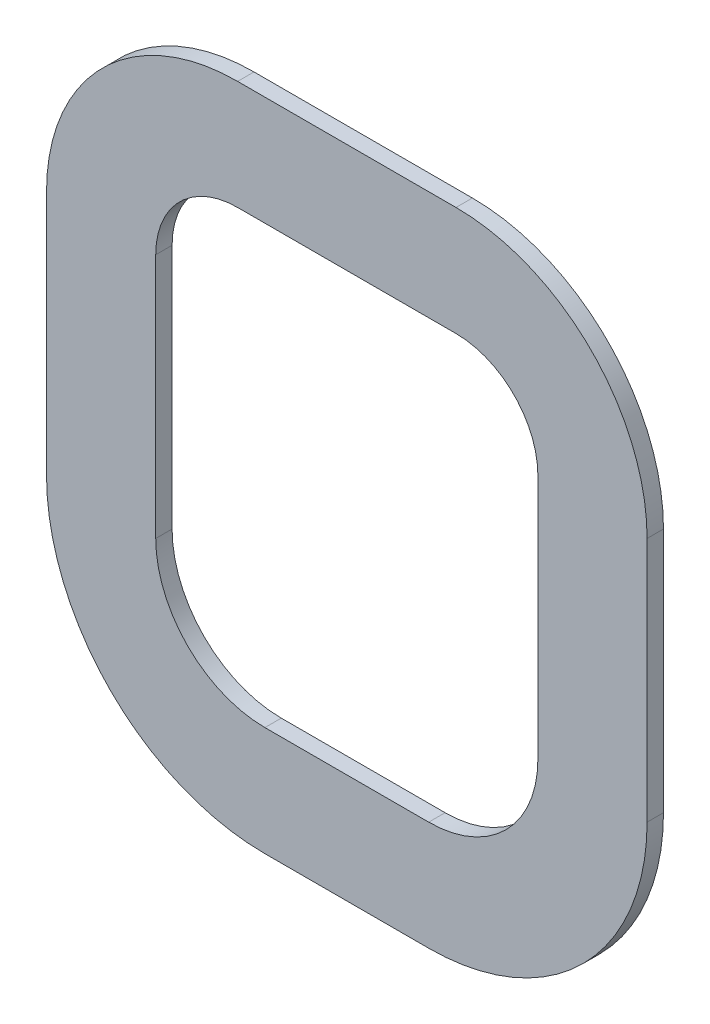
ISO-10303-21;
HEADER;
FILE_DESCRIPTION(('STEP AP214'),'2;1');
FILE_NAME('part.step','',(''),(''),'','','');
FILE_SCHEMA(('AUTOMOTIVE_DESIGN { 1 0 10303 214 1 1 1 1 }'));
ENDSEC;
DATA;
#1=APPLICATION_CONTEXT('core data for automotive mechanical design processes');
#2=APPLICATION_PROTOCOL_DEFINITION('international standard','automotive_design',2000,#1);
#3=PRODUCT_CONTEXT('',#1,'mechanical');
#4=PRODUCT('Part','Part','',(#3));
#5=PRODUCT_RELATED_PRODUCT_CATEGORY('part','',(#4));
#6=PRODUCT_DEFINITION_FORMATION('','',#4);
#7=PRODUCT_DEFINITION_CONTEXT('part definition',#1,'design');
#8=PRODUCT_DEFINITION('design','',#6,#7);
#9=PRODUCT_DEFINITION_SHAPE('','',#8);
#10=(LENGTH_UNIT() NAMED_UNIT(*) SI_UNIT(.MILLI.,.METRE.));
#11=(NAMED_UNIT(*) PLANE_ANGLE_UNIT() SI_UNIT($,.RADIAN.));
#12=(NAMED_UNIT(*) SI_UNIT($,.STERADIAN.) SOLID_ANGLE_UNIT());
#13=UNCERTAINTY_MEASURE_WITH_UNIT(LENGTH_MEASURE(1.E-05),#10,'distance_accuracy_value','');
#14=(GEOMETRIC_REPRESENTATION_CONTEXT(3) GLOBAL_UNCERTAINTY_ASSIGNED_CONTEXT((#13)) GLOBAL_UNIT_ASSIGNED_CONTEXT((#10,
#11,#12)) REPRESENTATION_CONTEXT('',''));
#15=CARTESIAN_POINT('',(0.,0.,0.));
#16=DIRECTION('',(0.,0.,1.));
#17=DIRECTION('',(1.,0.,0.));
#18=AXIS2_PLACEMENT_3D('',#15,#16,#17);
#19=CARTESIAN_POINT('',(-20.,17.,3.));
#20=DIRECTION('',(0.,0.,-1.));
#21=DIRECTION('',(-1.,0.,0.));
#22=AXIS2_PLACEMENT_3D('',#19,#20,#21);
#23=PLANE('',#22);
#24=CARTESIAN_POINT('',(-20.,17.,3.));
#25=DIRECTION('',(0.,0.,1.));
#26=DIRECTION('',(-1.,0.,0.));
#27=AXIS2_PLACEMENT_3D('',#24,#25,#26);
#28=CIRCLE('',#27,35.);
#29=CARTESIAN_POINT('',(-20.,52.,3.));
#30=VERTEX_POINT('',#29);
#31=CARTESIAN_POINT('',(-55.,17.,3.));
#32=VERTEX_POINT('',#31);
#33=EDGE_CURVE('E216',#30,#32,#28,.T.);
#34=ORIENTED_EDGE('',*,*,#33,.T.);
#35=DIRECTION('',(0.,-1.,0.));
#36=VECTOR('',#35,1.);
#37=CARTESIAN_POINT('',(-55.,17.,3.));
#38=LINE('',#37,#36);
#39=CARTESIAN_POINT('',(-55.,-28.,3.));
#40=VERTEX_POINT('',#39);
#41=EDGE_CURVE('E219',#32,#40,#38,.T.);
#42=ORIENTED_EDGE('',*,*,#41,.T.);
#43=CARTESIAN_POINT('',(-15.,-28.,3.));
#44=DIRECTION('',(0.,0.,1.));
#45=DIRECTION('',(1.,0.,0.));
#46=AXIS2_PLACEMENT_3D('',#43,#44,#45);
#47=CIRCLE('',#46,40.);
#48=CARTESIAN_POINT('',(-15.,-68.,3.));
#49=VERTEX_POINT('',#48);
#50=EDGE_CURVE('E222',#40,#49,#47,.T.);
#51=ORIENTED_EDGE('',*,*,#50,.T.);
#52=DIRECTION('',(1.,0.,0.));
#53=VECTOR('',#52,1.);
#54=CARTESIAN_POINT('',(-15.,-68.,3.));
#55=LINE('',#54,#53);
#56=CARTESIAN_POINT('',(15.,-68.,3.));
#57=VERTEX_POINT('',#56);
#58=EDGE_CURVE('E224',#49,#57,#55,.T.);
#59=ORIENTED_EDGE('',*,*,#58,.T.);
#60=CARTESIAN_POINT('',(15.,-28.,3.));
#61=DIRECTION('',(0.,0.,1.));
#62=DIRECTION('',(1.,0.,0.));
#63=AXIS2_PLACEMENT_3D('',#60,#61,#62);
#64=CIRCLE('',#63,40.);
#65=CARTESIAN_POINT('',(55.,-28.,3.));
#66=VERTEX_POINT('',#65);
#67=EDGE_CURVE('E226',#57,#66,#64,.T.);
#68=ORIENTED_EDGE('',*,*,#67,.T.);
#69=DIRECTION('',(0.,1.,0.));
#70=VECTOR('',#69,1.);
#71=CARTESIAN_POINT('',(55.,17.,3.));
#72=LINE('',#71,#70);
#73=CARTESIAN_POINT('',(55.,17.,3.));
#74=VERTEX_POINT('',#73);
#75=EDGE_CURVE('E228',#66,#74,#72,.T.);
#76=ORIENTED_EDGE('',*,*,#75,.T.);
#77=CARTESIAN_POINT('',(20.,17.,3.));
#78=DIRECTION('',(0.,0.,1.));
#79=DIRECTION('',(-1.,0.,0.));
#80=AXIS2_PLACEMENT_3D('',#77,#78,#79);
#81=CIRCLE('',#80,35.);
#82=CARTESIAN_POINT('',(20.,52.,3.));
#83=VERTEX_POINT('',#82);
#84=EDGE_CURVE('E230',#74,#83,#81,.T.);
#85=ORIENTED_EDGE('',*,*,#84,.T.);
#86=DIRECTION('',(-1.,0.,0.));
#87=VECTOR('',#86,1.);
#88=CARTESIAN_POINT('',(-20.,52.,3.));
#89=LINE('',#88,#87);
#90=EDGE_CURVE('E232',#83,#30,#89,.T.);
#91=ORIENTED_EDGE('',*,*,#90,.T.);
#92=EDGE_LOOP('',(#34,#42,#51,#59,#68,#76,#85,#91));
#93=FACE_BOUND('',#92,.T.);
#94=CARTESIAN_POINT('',(-20.,17.,3.));
#95=DIRECTION('',(0.,0.,1.));
#96=DIRECTION('',(-1.,0.,0.));
#97=AXIS2_PLACEMENT_3D('',#94,#95,#96);
#98=CIRCLE('',#97,15.);
#99=CARTESIAN_POINT('',(-20.,32.,3.));
#100=VERTEX_POINT('',#99);
#101=CARTESIAN_POINT('',(-35.,17.,3.));
#102=VERTEX_POINT('',#101);
#103=EDGE_CURVE('E150',#100,#102,#98,.T.);
#104=ORIENTED_EDGE('',*,*,#103,.F.);
#105=DIRECTION('',(-1.,0.,0.));
#106=VECTOR('',#105,1.);
#107=CARTESIAN_POINT('',(-20.,32.,3.));
#108=LINE('',#107,#106);
#109=CARTESIAN_POINT('',(20.,32.,3.));
#110=VERTEX_POINT('',#109);
#111=EDGE_CURVE('E183',#110,#100,#108,.T.);
#112=ORIENTED_EDGE('',*,*,#111,.F.);
#113=CARTESIAN_POINT('',(20.,17.,3.));
#114=DIRECTION('',(0.,0.,1.));
#115=DIRECTION('',(-1.,0.,0.));
#116=AXIS2_PLACEMENT_3D('',#113,#114,#115);
#117=CIRCLE('',#116,15.);
#118=CARTESIAN_POINT('',(35.,17.,3.));
#119=VERTEX_POINT('',#118);
#120=EDGE_CURVE('E181',#119,#110,#117,.T.);
#121=ORIENTED_EDGE('',*,*,#120,.F.);
#122=DIRECTION('',(0.,1.,0.));
#123=VECTOR('',#122,1.);
#124=CARTESIAN_POINT('',(35.,17.,3.));
#125=LINE('',#124,#123);
#126=CARTESIAN_POINT('',(35.,-28.,3.));
#127=VERTEX_POINT('',#126);
#128=EDGE_CURVE('E179',#127,#119,#125,.T.);
#129=ORIENTED_EDGE('',*,*,#128,.F.);
#130=CARTESIAN_POINT('',(15.,-28.,3.));
#131=DIRECTION('',(0.,0.,1.));
#132=DIRECTION('',(1.,0.,0.));
#133=AXIS2_PLACEMENT_3D('',#130,#131,#132);
#134=CIRCLE('',#133,20.);
#135=CARTESIAN_POINT('',(15.,-48.,3.));
#136=VERTEX_POINT('',#135);
#137=EDGE_CURVE('E177',#136,#127,#134,.T.);
#138=ORIENTED_EDGE('',*,*,#137,.F.);
#139=DIRECTION('',(1.,0.,0.));
#140=VECTOR('',#139,1.);
#141=CARTESIAN_POINT('',(-15.,-48.,3.));
#142=LINE('',#141,#140);
#143=CARTESIAN_POINT('',(-15.,-48.,3.));
#144=VERTEX_POINT('',#143);
#145=EDGE_CURVE('E173',#144,#136,#142,.T.);
#146=ORIENTED_EDGE('',*,*,#145,.F.);
#147=CARTESIAN_POINT('',(-15.,-28.,3.));
#148=DIRECTION('',(0.,0.,1.));
#149=DIRECTION('',(1.,0.,0.));
#150=AXIS2_PLACEMENT_3D('',#147,#148,#149);
#151=CIRCLE('',#150,20.);
#152=CARTESIAN_POINT('',(-35.,-28.,3.));
#153=VERTEX_POINT('',#152);
#154=EDGE_CURVE('E171',#153,#144,#151,.T.);
#155=ORIENTED_EDGE('',*,*,#154,.F.);
#156=DIRECTION('',(0.,-1.,0.));
#157=VECTOR('',#156,1.);
#158=CARTESIAN_POINT('',(-35.,17.,3.));
#159=LINE('',#158,#157);
#160=EDGE_CURVE('E158',#102,#153,#159,.T.);
#161=ORIENTED_EDGE('',*,*,#160,.F.);
#162=EDGE_LOOP('',(#104,#112,#121,#129,#138,#146,#155,#161));
#163=FACE_BOUND('',#162,.T.);
#164=ADVANCED_FACE('F37',(#93,#163),#23,.F.);
#165=CARTESIAN_POINT('',(-20.,17.,0.));
#166=DIRECTION('',(0.,0.,-1.));
#167=DIRECTION('',(-1.,0.,0.));
#168=AXIS2_PLACEMENT_3D('',#165,#166,#167);
#169=PLANE('',#168);
#170=CARTESIAN_POINT('',(-20.,17.,0.));
#171=DIRECTION('',(0.,0.,1.));
#172=DIRECTION('',(-1.,0.,0.));
#173=AXIS2_PLACEMENT_3D('',#170,#171,#172);
#174=CIRCLE('',#173,35.);
#175=CARTESIAN_POINT('',(-20.,52.,0.));
#176=VERTEX_POINT('',#175);
#177=CARTESIAN_POINT('',(-55.,17.,0.));
#178=VERTEX_POINT('',#177);
#179=EDGE_CURVE('E166',#176,#178,#174,.T.);
#180=ORIENTED_EDGE('',*,*,#179,.F.);
#181=DIRECTION('',(-1.,0.,0.));
#182=VECTOR('',#181,1.);
#183=CARTESIAN_POINT('',(-20.,52.,0.));
#184=LINE('',#183,#182);
#185=CARTESIAN_POINT('',(20.,52.,0.));
#186=VERTEX_POINT('',#185);
#187=EDGE_CURVE('E220',#186,#176,#184,.T.);
#188=ORIENTED_EDGE('',*,*,#187,.F.);
#189=CARTESIAN_POINT('',(20.,17.,0.));
#190=DIRECTION('',(0.,0.,1.));
#191=DIRECTION('',(-1.,0.,0.));
#192=AXIS2_PLACEMENT_3D('',#189,#190,#191);
#193=CIRCLE('',#192,35.);
#194=CARTESIAN_POINT('',(55.,17.,0.));
#195=VERTEX_POINT('',#194);
#196=EDGE_CURVE('E248',#195,#186,#193,.T.);
#197=ORIENTED_EDGE('',*,*,#196,.F.);
#198=DIRECTION('',(0.,1.,0.));
#199=VECTOR('',#198,1.);
#200=CARTESIAN_POINT('',(55.,17.,0.));
#201=LINE('',#200,#199);
#202=CARTESIAN_POINT('',(55.,-28.,0.));
#203=VERTEX_POINT('',#202);
#204=EDGE_CURVE('E246',#203,#195,#201,.T.);
#205=ORIENTED_EDGE('',*,*,#204,.F.);
#206=CARTESIAN_POINT('',(15.,-28.,0.));
#207=DIRECTION('',(0.,0.,1.));
#208=DIRECTION('',(1.,0.,0.));
#209=AXIS2_PLACEMENT_3D('',#206,#207,#208);
#210=CIRCLE('',#209,40.);
#211=CARTESIAN_POINT('',(15.,-68.,0.));
#212=VERTEX_POINT('',#211);
#213=EDGE_CURVE('E244',#212,#203,#210,.T.);
#214=ORIENTED_EDGE('',*,*,#213,.F.);
#215=DIRECTION('',(1.,0.,0.));
#216=VECTOR('',#215,1.);
#217=CARTESIAN_POINT('',(0.50000000000002,-68.,0.));
#218=LINE('',#217,#216);
#219=CARTESIAN_POINT('',(-15.,-68.,0.));
#220=VERTEX_POINT('',#219);
#221=EDGE_CURVE('E242',#220,#212,#218,.T.);
#222=ORIENTED_EDGE('',*,*,#221,.F.);
#223=CARTESIAN_POINT('',(-15.,-28.,0.));
#224=DIRECTION('',(0.,0.,1.));
#225=DIRECTION('',(1.,0.,0.));
#226=AXIS2_PLACEMENT_3D('',#223,#224,#225);
#227=CIRCLE('',#226,40.);
#228=CARTESIAN_POINT('',(-55.,-28.,0.));
#229=VERTEX_POINT('',#228);
#230=EDGE_CURVE('E239',#229,#220,#227,.T.);
#231=ORIENTED_EDGE('',*,*,#230,.F.);
#232=DIRECTION('',(0.,-1.,0.));
#233=VECTOR('',#232,1.);
#234=CARTESIAN_POINT('',(-55.,17.,0.));
#235=LINE('',#234,#233);
#236=EDGE_CURVE('E237',#178,#229,#235,.T.);
#237=ORIENTED_EDGE('',*,*,#236,.F.);
#238=EDGE_LOOP('',(#180,#188,#197,#205,#214,#222,#231,#237));
#239=FACE_BOUND('',#238,.T.);
#240=DIRECTION('',(-1.,0.,0.));
#241=VECTOR('',#240,1.);
#242=CARTESIAN_POINT('',(-20.,32.,0.));
#243=LINE('',#242,#241);
#244=CARTESIAN_POINT('',(20.,32.,0.));
#245=VERTEX_POINT('',#244);
#246=CARTESIAN_POINT('',(-20.,32.,0.));
#247=VERTEX_POINT('',#246);
#248=EDGE_CURVE('E159',#245,#247,#243,.T.);
#249=ORIENTED_EDGE('',*,*,#248,.T.);
#250=CARTESIAN_POINT('',(-20.,17.,0.));
#251=DIRECTION('',(0.,0.,1.));
#252=DIRECTION('',(-1.,0.,0.));
#253=AXIS2_PLACEMENT_3D('',#250,#251,#252);
#254=CIRCLE('',#253,15.);
#255=CARTESIAN_POINT('',(-35.,17.,0.));
#256=VERTEX_POINT('',#255);
#257=EDGE_CURVE('E60',#247,#256,#254,.T.);
#258=ORIENTED_EDGE('',*,*,#257,.T.);
#259=DIRECTION('',(0.,-1.,0.));
#260=VECTOR('',#259,1.);
#261=CARTESIAN_POINT('',(-35.,17.,0.));
#262=LINE('',#261,#260);
#263=CARTESIAN_POINT('',(-35.,-28.,0.));
#264=VERTEX_POINT('',#263);
#265=EDGE_CURVE('E165',#256,#264,#262,.T.);
#266=ORIENTED_EDGE('',*,*,#265,.T.);
#267=CARTESIAN_POINT('',(-15.,-28.,0.));
#268=DIRECTION('',(0.,0.,1.));
#269=DIRECTION('',(1.,0.,0.));
#270=AXIS2_PLACEMENT_3D('',#267,#268,#269);
#271=CIRCLE('',#270,20.);
#272=CARTESIAN_POINT('',(-15.,-48.,0.));
#273=VERTEX_POINT('',#272);
#274=EDGE_CURVE('E187',#264,#273,#271,.T.);
#275=ORIENTED_EDGE('',*,*,#274,.T.);
#276=DIRECTION('',(1.,0.,0.));
#277=VECTOR('',#276,1.);
#278=CARTESIAN_POINT('',(0.50000000000002,-48.,0.));
#279=LINE('',#278,#277);
#280=CARTESIAN_POINT('',(15.,-48.,0.));
#281=VERTEX_POINT('',#280);
#282=EDGE_CURVE('E190',#273,#281,#279,.T.);
#283=ORIENTED_EDGE('',*,*,#282,.T.);
#284=CARTESIAN_POINT('',(15.,-28.,0.));
#285=DIRECTION('',(0.,0.,1.));
#286=DIRECTION('',(1.,0.,0.));
#287=AXIS2_PLACEMENT_3D('',#284,#285,#286);
#288=CIRCLE('',#287,20.);
#289=CARTESIAN_POINT('',(35.,-28.,0.));
#290=VERTEX_POINT('',#289);
#291=EDGE_CURVE('E193',#281,#290,#288,.T.);
#292=ORIENTED_EDGE('',*,*,#291,.T.);
#293=DIRECTION('',(0.,1.,0.));
#294=VECTOR('',#293,1.);
#295=CARTESIAN_POINT('',(35.,17.,0.));
#296=LINE('',#295,#294);
#297=CARTESIAN_POINT('',(35.,17.,0.));
#298=VERTEX_POINT('',#297);
#299=EDGE_CURVE('E196',#290,#298,#296,.T.);
#300=ORIENTED_EDGE('',*,*,#299,.T.);
#301=CARTESIAN_POINT('',(20.,17.,0.));
#302=DIRECTION('',(0.,0.,1.));
#303=DIRECTION('',(-1.,0.,0.));
#304=AXIS2_PLACEMENT_3D('',#301,#302,#303);
#305=CIRCLE('',#304,15.);
#306=EDGE_CURVE('E199',#298,#245,#305,.T.);
#307=ORIENTED_EDGE('',*,*,#306,.T.);
#308=EDGE_LOOP('',(#249,#258,#266,#275,#283,#292,#300,#307));
#309=FACE_BOUND('',#308,.T.);
#310=ADVANCED_FACE('F277',(#239,#309),#169,.T.);
#311=CARTESIAN_POINT('',(-20.,17.,3.));
#312=DIRECTION('',(0.,0.,-1.));
#313=DIRECTION('',(-1.,0.,0.));
#314=AXIS2_PLACEMENT_3D('',#311,#312,#313);
#315=CYLINDRICAL_SURFACE('',#314,35.);
#316=ORIENTED_EDGE('',*,*,#179,.T.);
#317=DIRECTION('',(0.,0.,-1.));
#318=VECTOR('',#317,1.);
#319=CARTESIAN_POINT('',(-55.,17.,3.));
#320=LINE('',#319,#318);
#321=EDGE_CURVE('E11',#32,#178,#320,.T.);
#322=ORIENTED_EDGE('',*,*,#321,.F.);
#323=ORIENTED_EDGE('',*,*,#33,.F.);
#324=DIRECTION('',(0.,0.,-1.));
#325=VECTOR('',#324,1.);
#326=CARTESIAN_POINT('',(-20.,52.,3.));
#327=LINE('',#326,#325);
#328=EDGE_CURVE('E234',#30,#176,#327,.T.);
#329=ORIENTED_EDGE('',*,*,#328,.T.);
#330=EDGE_LOOP('',(#316,#322,#323,#329));
#331=FACE_BOUND('',#330,.T.);
#332=ADVANCED_FACE('F39',(#331),#315,.T.);
#333=CARTESIAN_POINT('',(-55.,17.,3.));
#334=DIRECTION('',(1.,0.,0.));
#335=DIRECTION('',(0.,0.,-1.));
#336=AXIS2_PLACEMENT_3D('',#333,#334,#335);
#337=PLANE('',#336);
#338=ORIENTED_EDGE('',*,*,#236,.T.);
#339=DIRECTION('',(0.,0.,-1.));
#340=VECTOR('',#339,1.);
#341=CARTESIAN_POINT('',(-55.,-28.,3.));
#342=LINE('',#341,#340);
#343=EDGE_CURVE('E45',#40,#229,#342,.T.);
#344=ORIENTED_EDGE('',*,*,#343,.F.);
#345=ORIENTED_EDGE('',*,*,#41,.F.);
#346=ORIENTED_EDGE('',*,*,#321,.T.);
#347=EDGE_LOOP('',(#338,#344,#345,#346));
#348=FACE_BOUND('',#347,.T.);
#349=ADVANCED_FACE('F294',(#348),#337,.F.);
#350=CARTESIAN_POINT('',(-15.,-28.,3.));
#351=DIRECTION('',(0.,0.,-1.));
#352=DIRECTION('',(-1.,0.,0.));
#353=AXIS2_PLACEMENT_3D('',#350,#351,#352);
#354=CYLINDRICAL_SURFACE('',#353,40.);
#355=ORIENTED_EDGE('',*,*,#230,.T.);
#356=DIRECTION('',(0.,0.,-1.));
#357=VECTOR('',#356,1.);
#358=CARTESIAN_POINT('',(-15.,-68.,3.));
#359=LINE('',#358,#357);
#360=EDGE_CURVE('E265',#49,#220,#359,.T.);
#361=ORIENTED_EDGE('',*,*,#360,.F.);
#362=ORIENTED_EDGE('',*,*,#50,.F.);
#363=ORIENTED_EDGE('',*,*,#343,.T.);
#364=EDGE_LOOP('',(#355,#361,#362,#363));
#365=FACE_BOUND('',#364,.T.);
#366=ADVANCED_FACE('F272',(#365),#354,.T.);
#367=CARTESIAN_POINT('',(0.50000000000002,-68.,3.));
#368=DIRECTION('',(0.,1.,0.));
#369=DIRECTION('',(0.,0.,1.));
#370=AXIS2_PLACEMENT_3D('',#367,#368,#369);
#371=PLANE('',#370);
#372=ORIENTED_EDGE('',*,*,#221,.T.);
#373=DIRECTION('',(0.,0.,-1.));
#374=VECTOR('',#373,1.);
#375=CARTESIAN_POINT('',(15.,-68.,3.));
#376=LINE('',#375,#374);
#377=EDGE_CURVE('E262',#57,#212,#376,.T.);
#378=ORIENTED_EDGE('',*,*,#377,.F.);
#379=ORIENTED_EDGE('',*,*,#58,.F.);
#380=ORIENTED_EDGE('',*,*,#360,.T.);
#381=EDGE_LOOP('',(#372,#378,#379,#380));
#382=FACE_BOUND('',#381,.T.);
#383=ADVANCED_FACE('F283',(#382),#371,.F.);
#384=CARTESIAN_POINT('',(15.,-28.,3.));
#385=DIRECTION('',(0.,0.,-1.));
#386=DIRECTION('',(-1.,0.,0.));
#387=AXIS2_PLACEMENT_3D('',#384,#385,#386);
#388=CYLINDRICAL_SURFACE('',#387,40.);
#389=ORIENTED_EDGE('',*,*,#213,.T.);
#390=DIRECTION('',(0.,0.,-1.));
#391=VECTOR('',#390,1.);
#392=CARTESIAN_POINT('',(55.,-28.,3.));
#393=LINE('',#392,#391);
#394=EDGE_CURVE('E259',#66,#203,#393,.T.);
#395=ORIENTED_EDGE('',*,*,#394,.F.);
#396=ORIENTED_EDGE('',*,*,#67,.F.);
#397=ORIENTED_EDGE('',*,*,#377,.T.);
#398=EDGE_LOOP('',(#389,#395,#396,#397));
#399=FACE_BOUND('',#398,.T.);
#400=ADVANCED_FACE('F287',(#399),#388,.T.);
#401=CARTESIAN_POINT('',(55.,17.,3.));
#402=DIRECTION('',(-1.,0.,0.));
#403=DIRECTION('',(0.,-1.,0.));
#404=AXIS2_PLACEMENT_3D('',#401,#402,#403);
#405=PLANE('',#404);
#406=ORIENTED_EDGE('',*,*,#204,.T.);
#407=DIRECTION('',(0.,0.,-1.));
#408=VECTOR('',#407,1.);
#409=CARTESIAN_POINT('',(55.,17.,3.));
#410=LINE('',#409,#408);
#411=EDGE_CURVE('E256',#74,#195,#410,.T.);
#412=ORIENTED_EDGE('',*,*,#411,.F.);
#413=ORIENTED_EDGE('',*,*,#75,.F.);
#414=ORIENTED_EDGE('',*,*,#394,.T.);
#415=EDGE_LOOP('',(#406,#412,#413,#414));
#416=FACE_BOUND('',#415,.T.);
#417=ADVANCED_FACE('F307',(#416),#405,.F.);
#418=CARTESIAN_POINT('',(20.,17.,3.));
#419=DIRECTION('',(0.,0.,-1.));
#420=DIRECTION('',(-1.,0.,0.));
#421=AXIS2_PLACEMENT_3D('',#418,#419,#420);
#422=CYLINDRICAL_SURFACE('',#421,35.);
#423=ORIENTED_EDGE('',*,*,#196,.T.);
#424=DIRECTION('',(0.,0.,-1.));
#425=VECTOR('',#424,1.);
#426=CARTESIAN_POINT('',(20.,52.,3.));
#427=LINE('',#426,#425);
#428=EDGE_CURVE('E253',#83,#186,#427,.T.);
#429=ORIENTED_EDGE('',*,*,#428,.F.);
#430=ORIENTED_EDGE('',*,*,#84,.F.);
#431=ORIENTED_EDGE('',*,*,#411,.T.);
#432=EDGE_LOOP('',(#423,#429,#430,#431));
#433=FACE_BOUND('',#432,.T.);
#434=ADVANCED_FACE('F305',(#433),#422,.T.);
#435=CARTESIAN_POINT('',(-20.,52.,3.));
#436=DIRECTION('',(0.,-1.,0.));
#437=DIRECTION('',(1.,0.,0.));
#438=AXIS2_PLACEMENT_3D('',#435,#436,#437);
#439=PLANE('',#438);
#440=ORIENTED_EDGE('',*,*,#187,.T.);
#441=ORIENTED_EDGE('',*,*,#328,.F.);
#442=ORIENTED_EDGE('',*,*,#90,.F.);
#443=ORIENTED_EDGE('',*,*,#428,.T.);
#444=EDGE_LOOP('',(#440,#441,#442,#443));
#445=FACE_BOUND('',#444,.T.);
#446=ADVANCED_FACE('F300',(#445),#439,.F.);
#447=CARTESIAN_POINT('',(-20.,17.,3.));
#448=DIRECTION('',(0.,0.,-1.));
#449=DIRECTION('',(-1.,0.,0.));
#450=AXIS2_PLACEMENT_3D('',#447,#448,#449);
#451=CYLINDRICAL_SURFACE('',#450,15.);
#452=ORIENTED_EDGE('',*,*,#257,.F.);
#453=DIRECTION('',(0.,0.,-1.));
#454=VECTOR('',#453,1.);
#455=CARTESIAN_POINT('',(-20.,32.,3.));
#456=LINE('',#455,#454);
#457=EDGE_CURVE('E154',#100,#247,#456,.T.);
#458=ORIENTED_EDGE('',*,*,#457,.F.);
#459=ORIENTED_EDGE('',*,*,#103,.T.);
#460=DIRECTION('',(0.,0.,-1.));
#461=VECTOR('',#460,1.);
#462=CARTESIAN_POINT('',(-35.,17.,3.));
#463=LINE('',#462,#461);
#464=EDGE_CURVE('E153',#102,#256,#463,.T.);
#465=ORIENTED_EDGE('',*,*,#464,.T.);
#466=EDGE_LOOP('',(#452,#458,#459,#465));
#467=FACE_BOUND('',#466,.T.);
#468=ADVANCED_FACE('F152',(#467),#451,.F.);
#469=CARTESIAN_POINT('',(-35.,17.,3.));
#470=DIRECTION('',(1.,0.,0.));
#471=DIRECTION('',(0.,1.,0.));
#472=AXIS2_PLACEMENT_3D('',#469,#470,#471);
#473=PLANE('',#472);
#474=ORIENTED_EDGE('',*,*,#265,.F.);
#475=ORIENTED_EDGE('',*,*,#464,.F.);
#476=ORIENTED_EDGE('',*,*,#160,.T.);
#477=DIRECTION('',(0.,0.,-1.));
#478=VECTOR('',#477,1.);
#479=CARTESIAN_POINT('',(-35.,-28.,3.));
#480=LINE('',#479,#478);
#481=EDGE_CURVE('E167',#153,#264,#480,.T.);
#482=ORIENTED_EDGE('',*,*,#481,.T.);
#483=EDGE_LOOP('',(#474,#475,#476,#482));
#484=FACE_BOUND('',#483,.T.);
#485=ADVANCED_FACE('F162',(#484),#473,.T.);
#486=CARTESIAN_POINT('',(-15.,-28.,3.));
#487=DIRECTION('',(0.,0.,-1.));
#488=DIRECTION('',(-1.,0.,0.));
#489=AXIS2_PLACEMENT_3D('',#486,#487,#488);
#490=CYLINDRICAL_SURFACE('',#489,20.);
#491=ORIENTED_EDGE('',*,*,#274,.F.);
#492=ORIENTED_EDGE('',*,*,#481,.F.);
#493=ORIENTED_EDGE('',*,*,#154,.T.);
#494=DIRECTION('',(0.,0.,-1.));
#495=VECTOR('',#494,1.);
#496=CARTESIAN_POINT('',(-15.,-48.,3.));
#497=LINE('',#496,#495);
#498=EDGE_CURVE('E212',#144,#273,#497,.T.);
#499=ORIENTED_EDGE('',*,*,#498,.T.);
#500=EDGE_LOOP('',(#491,#492,#493,#499));
#501=FACE_BOUND('',#500,.T.);
#502=ADVANCED_FACE('F332',(#501),#490,.F.);
#503=CARTESIAN_POINT('',(0.50000000000002,-48.,3.));
#504=DIRECTION('',(0.,1.,0.));
#505=DIRECTION('',(0.,0.,1.));
#506=AXIS2_PLACEMENT_3D('',#503,#504,#505);
#507=PLANE('',#506);
#508=ORIENTED_EDGE('',*,*,#282,.F.);
#509=ORIENTED_EDGE('',*,*,#498,.F.);
#510=ORIENTED_EDGE('',*,*,#145,.T.);
#511=DIRECTION('',(0.,0.,-1.));
#512=VECTOR('',#511,1.);
#513=CARTESIAN_POINT('',(15.,-48.,3.));
#514=LINE('',#513,#512);
#515=EDGE_CURVE('E210',#136,#281,#514,.T.);
#516=ORIENTED_EDGE('',*,*,#515,.T.);
#517=EDGE_LOOP('',(#508,#509,#510,#516));
#518=FACE_BOUND('',#517,.T.);
#519=ADVANCED_FACE('F336',(#518),#507,.T.);
#520=CARTESIAN_POINT('',(15.,-28.,3.));
#521=DIRECTION('',(0.,0.,-1.));
#522=DIRECTION('',(-1.,0.,0.));
#523=AXIS2_PLACEMENT_3D('',#520,#521,#522);
#524=CYLINDRICAL_SURFACE('',#523,20.);
#525=ORIENTED_EDGE('',*,*,#291,.F.);
#526=ORIENTED_EDGE('',*,*,#515,.F.);
#527=ORIENTED_EDGE('',*,*,#137,.T.);
#528=DIRECTION('',(0.,0.,-1.));
#529=VECTOR('',#528,1.);
#530=CARTESIAN_POINT('',(35.,-28.,3.));
#531=LINE('',#530,#529);
#532=EDGE_CURVE('E208',#127,#290,#531,.T.);
#533=ORIENTED_EDGE('',*,*,#532,.T.);
#534=EDGE_LOOP('',(#525,#526,#527,#533));
#535=FACE_BOUND('',#534,.T.);
#536=ADVANCED_FACE('F342',(#535),#524,.F.);
#537=CARTESIAN_POINT('',(35.,17.,3.));
#538=DIRECTION('',(-1.,0.,0.));
#539=DIRECTION('',(0.,-1.,0.));
#540=AXIS2_PLACEMENT_3D('',#537,#538,#539);
#541=PLANE('',#540);
#542=ORIENTED_EDGE('',*,*,#299,.F.);
#543=ORIENTED_EDGE('',*,*,#532,.F.);
#544=ORIENTED_EDGE('',*,*,#128,.T.);
#545=DIRECTION('',(0.,0.,-1.));
#546=VECTOR('',#545,1.);
#547=CARTESIAN_POINT('',(35.,17.,3.));
#548=LINE('',#547,#546);
#549=EDGE_CURVE('E206',#119,#298,#548,.T.);
#550=ORIENTED_EDGE('',*,*,#549,.T.);
#551=EDGE_LOOP('',(#542,#543,#544,#550));
#552=FACE_BOUND('',#551,.T.);
#553=ADVANCED_FACE('F346',(#552),#541,.T.);
#554=CARTESIAN_POINT('',(20.,17.,3.));
#555=DIRECTION('',(0.,0.,-1.));
#556=DIRECTION('',(-1.,0.,0.));
#557=AXIS2_PLACEMENT_3D('',#554,#555,#556);
#558=CYLINDRICAL_SURFACE('',#557,15.);
#559=ORIENTED_EDGE('',*,*,#306,.F.);
#560=ORIENTED_EDGE('',*,*,#549,.F.);
#561=ORIENTED_EDGE('',*,*,#120,.T.);
#562=DIRECTION('',(0.,0.,-1.));
#563=VECTOR('',#562,1.);
#564=CARTESIAN_POINT('',(20.,32.,3.));
#565=LINE('',#564,#563);
#566=EDGE_CURVE('E52',#110,#245,#565,.T.);
#567=ORIENTED_EDGE('',*,*,#566,.T.);
#568=EDGE_LOOP('',(#559,#560,#561,#567));
#569=FACE_BOUND('',#568,.T.);
#570=ADVANCED_FACE('F350',(#569),#558,.F.);
#571=CARTESIAN_POINT('',(-20.,32.,3.));
#572=DIRECTION('',(0.,-1.,0.));
#573=DIRECTION('',(1.,0.,0.));
#574=AXIS2_PLACEMENT_3D('',#571,#572,#573);
#575=PLANE('',#574);
#576=ORIENTED_EDGE('',*,*,#248,.F.);
#577=ORIENTED_EDGE('',*,*,#566,.F.);
#578=ORIENTED_EDGE('',*,*,#111,.T.);
#579=ORIENTED_EDGE('',*,*,#457,.T.);
#580=EDGE_LOOP('',(#576,#577,#578,#579));
#581=FACE_BOUND('',#580,.T.);
#582=ADVANCED_FACE('F354',(#581),#575,.T.);
#583=CLOSED_SHELL('',(#164,#310,#332,#349,#366,#383,#400,#417,#434,#446,#468,#485,#502,#519,
#536,#553,#570,#582));
#584=MANIFOLD_SOLID_BREP('B2',#583);
#585=ADVANCED_BREP_SHAPE_REPRESENTATION('',(#18,#584),#14);
#586=SHAPE_DEFINITION_REPRESENTATION(#9,#585);
ENDSEC;
END-ISO-10303-21;
